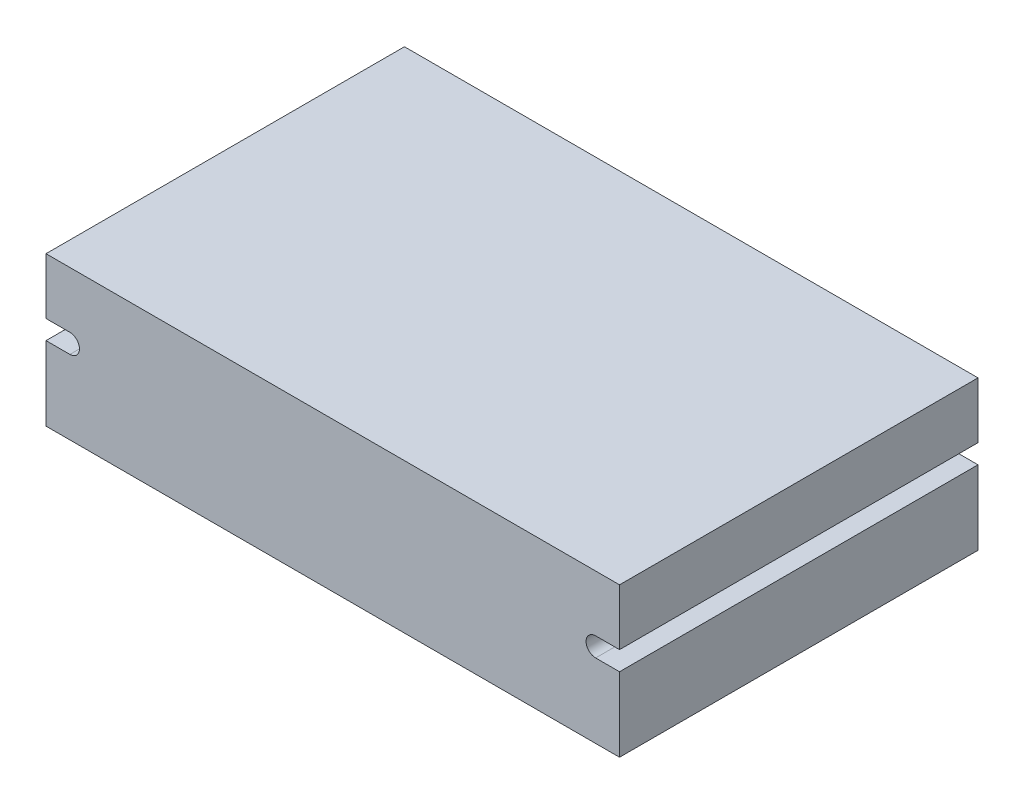
ISO-10303-21;
HEADER;
FILE_DESCRIPTION(('STEP AP214'),'2;1');
FILE_NAME('part.step','',(''),(''),'','','');
FILE_SCHEMA(('AUTOMOTIVE_DESIGN { 1 0 10303 214 1 1 1 1 }'));
ENDSEC;
DATA;
#1=APPLICATION_CONTEXT('core data for automotive mechanical design processes');
#2=APPLICATION_PROTOCOL_DEFINITION('international standard','automotive_design',2000,#1);
#3=PRODUCT_CONTEXT('',#1,'mechanical');
#4=PRODUCT('Part','Part','',(#3));
#5=PRODUCT_RELATED_PRODUCT_CATEGORY('part','',(#4));
#6=PRODUCT_DEFINITION_FORMATION('','',#4);
#7=PRODUCT_DEFINITION_CONTEXT('part definition',#1,'design');
#8=PRODUCT_DEFINITION('design','',#6,#7);
#9=PRODUCT_DEFINITION_SHAPE('','',#8);
#10=(LENGTH_UNIT() NAMED_UNIT(*) SI_UNIT(.MILLI.,.METRE.));
#11=(NAMED_UNIT(*) PLANE_ANGLE_UNIT() SI_UNIT($,.RADIAN.));
#12=(NAMED_UNIT(*) SI_UNIT($,.STERADIAN.) SOLID_ANGLE_UNIT());
#13=UNCERTAINTY_MEASURE_WITH_UNIT(LENGTH_MEASURE(1.E-05),#10,'distance_accuracy_value','');
#14=(GEOMETRIC_REPRESENTATION_CONTEXT(3) GLOBAL_UNCERTAINTY_ASSIGNED_CONTEXT((#13)) GLOBAL_UNIT_ASSIGNED_CONTEXT((#10,
#11,#12)) REPRESENTATION_CONTEXT('',''));
#15=CARTESIAN_POINT('',(0.,0.,0.));
#16=DIRECTION('',(0.,0.,1.));
#17=DIRECTION('',(1.,0.,0.));
#18=AXIS2_PLACEMENT_3D('',#15,#16,#17);
#19=CARTESIAN_POINT('',(0.,0.,60.));
#20=DIRECTION('',(1.,0.,0.));
#21=DIRECTION('',(0.,0.,-1.));
#22=AXIS2_PLACEMENT_3D('',#19,#20,#21);
#23=PLANE('',#22);
#24=DIRECTION('',(0.,-1.,0.));
#25=VECTOR('',#24,1.);
#26=CARTESIAN_POINT('',(0.,0.,0.));
#27=LINE('',#26,#25);
#28=CARTESIAN_POINT('',(0.,12.398749748951,0.));
#29=VERTEX_POINT('',#28);
#30=CARTESIAN_POINT('',(0.,0.,0.));
#31=VERTEX_POINT('',#30);
#32=EDGE_CURVE('E153',#29,#31,#27,.T.);
#33=ORIENTED_EDGE('',*,*,#32,.T.);
#34=DIRECTION('',(0.,0.,-1.));
#35=VECTOR('',#34,1.);
#36=CARTESIAN_POINT('',(0.,0.,60.));
#37=LINE('',#36,#35);
#38=CARTESIAN_POINT('',(0.,0.,60.));
#39=VERTEX_POINT('',#38);
#40=EDGE_CURVE('E11',#39,#31,#37,.T.);
#41=ORIENTED_EDGE('',*,*,#40,.F.);
#42=DIRECTION('',(0.,-1.,0.));
#43=VECTOR('',#42,1.);
#44=CARTESIAN_POINT('',(0.,0.,60.));
#45=LINE('',#44,#43);
#46=CARTESIAN_POINT('',(0.,12.398749748951,60.));
#47=VERTEX_POINT('',#46);
#48=EDGE_CURVE('E175',#47,#39,#45,.T.);
#49=ORIENTED_EDGE('',*,*,#48,.F.);
#50=DIRECTION('',(0.,0.,-1.));
#51=VECTOR('',#50,1.);
#52=CARTESIAN_POINT('',(0.,12.398749748951,60.));
#53=LINE('',#52,#51);
#54=EDGE_CURVE('E149',#47,#29,#53,.T.);
#55=ORIENTED_EDGE('',*,*,#54,.T.);
#56=EDGE_LOOP('',(#33,#41,#49,#55));
#57=FACE_BOUND('',#56,.T.);
#58=ADVANCED_FACE('F33',(#57),#23,.F.);
#59=CARTESIAN_POINT('',(0.,0.,60.));
#60=DIRECTION('',(0.,1.,0.));
#61=DIRECTION('',(0.,0.,1.));
#62=AXIS2_PLACEMENT_3D('',#59,#60,#61);
#63=PLANE('',#62);
#64=DIRECTION('',(1.,0.,0.));
#65=VECTOR('',#64,1.);
#66=CARTESIAN_POINT('',(0.,0.,0.));
#67=LINE('',#66,#65);
#68=CARTESIAN_POINT('',(96.,0.,0.));
#69=VERTEX_POINT('',#68);
#70=EDGE_CURVE('E156',#31,#69,#67,.T.);
#71=ORIENTED_EDGE('',*,*,#70,.T.);
#72=DIRECTION('',(0.,0.,-1.));
#73=VECTOR('',#72,1.);
#74=CARTESIAN_POINT('',(96.,0.,60.));
#75=LINE('',#74,#73);
#76=CARTESIAN_POINT('',(96.,0.,60.));
#77=VERTEX_POINT('',#76);
#78=EDGE_CURVE('E41',#77,#69,#75,.T.);
#79=ORIENTED_EDGE('',*,*,#78,.F.);
#80=DIRECTION('',(1.,0.,0.));
#81=VECTOR('',#80,1.);
#82=CARTESIAN_POINT('',(0.,0.,60.));
#83=LINE('',#82,#81);
#84=EDGE_CURVE('E104',#39,#77,#83,.T.);
#85=ORIENTED_EDGE('',*,*,#84,.F.);
#86=ORIENTED_EDGE('',*,*,#40,.T.);
#87=EDGE_LOOP('',(#71,#79,#85,#86));
#88=FACE_BOUND('',#87,.T.);
#89=ADVANCED_FACE('F253',(#88),#63,.F.);
#90=CARTESIAN_POINT('',(96.,0.,60.));
#91=DIRECTION('',(-1.,0.,0.));
#92=DIRECTION('',(0.,0.,1.));
#93=AXIS2_PLACEMENT_3D('',#90,#91,#92);
#94=PLANE('',#93);
#95=DIRECTION('',(0.,1.,0.));
#96=VECTOR('',#95,1.);
#97=CARTESIAN_POINT('',(96.,0.,0.));
#98=LINE('',#97,#96);
#99=CARTESIAN_POINT('',(96.,12.398749748951,0.));
#100=VERTEX_POINT('',#99);
#101=EDGE_CURVE('E158',#69,#100,#98,.T.);
#102=ORIENTED_EDGE('',*,*,#101,.T.);
#103=DIRECTION('',(0.,0.,-1.));
#104=VECTOR('',#103,1.);
#105=CARTESIAN_POINT('',(96.,12.398749748951,60.));
#106=LINE('',#105,#104);
#107=CARTESIAN_POINT('',(96.,12.398749748951,60.));
#108=VERTEX_POINT('',#107);
#109=EDGE_CURVE('E194',#108,#100,#106,.T.);
#110=ORIENTED_EDGE('',*,*,#109,.F.);
#111=DIRECTION('',(0.,1.,0.));
#112=VECTOR('',#111,1.);
#113=CARTESIAN_POINT('',(96.,0.,60.));
#114=LINE('',#113,#112);
#115=EDGE_CURVE('E202',#77,#108,#114,.T.);
#116=ORIENTED_EDGE('',*,*,#115,.F.);
#117=ORIENTED_EDGE('',*,*,#78,.T.);
#118=EDGE_LOOP('',(#102,#110,#116,#117));
#119=FACE_BOUND('',#118,.T.);
#120=ADVANCED_FACE('F200',(#119),#94,.F.);
#121=CARTESIAN_POINT('',(96.,12.398749748951,60.));
#122=DIRECTION('',(0.,-1.,0.));
#123=DIRECTION('',(0.,0.,-1.));
#124=AXIS2_PLACEMENT_3D('',#121,#122,#123);
#125=PLANE('',#124);
#126=DIRECTION('',(-1.,0.,0.));
#127=VECTOR('',#126,1.);
#128=CARTESIAN_POINT('',(96.,12.398749748951,0.));
#129=LINE('',#128,#127);
#130=CARTESIAN_POINT('',(92.,12.398749748951,0.));
#131=VERTEX_POINT('',#130);
#132=EDGE_CURVE('E160',#100,#131,#129,.T.);
#133=ORIENTED_EDGE('',*,*,#132,.T.);
#134=DIRECTION('',(0.,0.,-1.));
#135=VECTOR('',#134,1.);
#136=CARTESIAN_POINT('',(92.,12.398749748951,60.));
#137=LINE('',#136,#135);
#138=CARTESIAN_POINT('',(92.,12.398749748951,60.));
#139=VERTEX_POINT('',#138);
#140=EDGE_CURVE('E191',#139,#131,#137,.T.);
#141=ORIENTED_EDGE('',*,*,#140,.F.);
#142=DIRECTION('',(-1.,0.,0.));
#143=VECTOR('',#142,1.);
#144=CARTESIAN_POINT('',(96.,12.398749748951,60.));
#145=LINE('',#144,#143);
#146=EDGE_CURVE('E220',#108,#139,#145,.T.);
#147=ORIENTED_EDGE('',*,*,#146,.F.);
#148=ORIENTED_EDGE('',*,*,#109,.T.);
#149=EDGE_LOOP('',(#133,#141,#147,#148));
#150=FACE_BOUND('',#149,.T.);
#151=ADVANCED_FACE('F211',(#150),#125,.F.);
#152=CARTESIAN_POINT('',(92.,14.,60.));
#153=DIRECTION('',(0.,0.,-1.));
#154=DIRECTION('',(-1.,0.,0.));
#155=AXIS2_PLACEMENT_3D('',#152,#153,#154);
#156=CYLINDRICAL_SURFACE('',#155,1.60125025104899);
#157=CARTESIAN_POINT('',(92.,14.,0.));
#158=DIRECTION('',(0.,0.,-1.));
#159=DIRECTION('',(-1.,0.,0.));
#160=AXIS2_PLACEMENT_3D('',#157,#158,#159);
#161=CIRCLE('',#160,1.60125025104899);
#162=CARTESIAN_POINT('',(92.,15.601250251049,0.));
#163=VERTEX_POINT('',#162);
#164=EDGE_CURVE('E162',#131,#163,#161,.T.);
#165=ORIENTED_EDGE('',*,*,#164,.T.);
#166=DIRECTION('',(0.,0.,-1.));
#167=VECTOR('',#166,1.);
#168=CARTESIAN_POINT('',(92.,15.601250251049,60.));
#169=LINE('',#168,#167);
#170=CARTESIAN_POINT('',(92.,15.601250251049,60.));
#171=VERTEX_POINT('',#170);
#172=EDGE_CURVE('E188',#171,#163,#169,.T.);
#173=ORIENTED_EDGE('',*,*,#172,.F.);
#174=CARTESIAN_POINT('',(92.,14.,60.));
#175=DIRECTION('',(0.,0.,-1.));
#176=DIRECTION('',(-1.,0.,0.));
#177=AXIS2_PLACEMENT_3D('',#174,#175,#176);
#178=CIRCLE('',#177,1.60125025104899);
#179=EDGE_CURVE('E217',#139,#171,#178,.T.);
#180=ORIENTED_EDGE('',*,*,#179,.F.);
#181=ORIENTED_EDGE('',*,*,#140,.T.);
#182=EDGE_LOOP('',(#165,#173,#180,#181));
#183=FACE_BOUND('',#182,.T.);
#184=ADVANCED_FACE('F215',(#183),#156,.F.);
#185=CARTESIAN_POINT('',(96.,15.601250251049,60.));
#186=DIRECTION('',(0.,1.,0.));
#187=DIRECTION('',(0.,0.,1.));
#188=AXIS2_PLACEMENT_3D('',#185,#186,#187);
#189=PLANE('',#188);
#190=DIRECTION('',(1.,0.,0.));
#191=VECTOR('',#190,1.);
#192=CARTESIAN_POINT('',(96.,15.601250251049,0.));
#193=LINE('',#192,#191);
#194=CARTESIAN_POINT('',(96.,15.601250251049,0.));
#195=VERTEX_POINT('',#194);
#196=EDGE_CURVE('E164',#163,#195,#193,.T.);
#197=ORIENTED_EDGE('',*,*,#196,.T.);
#198=DIRECTION('',(0.,0.,-1.));
#199=VECTOR('',#198,1.);
#200=CARTESIAN_POINT('',(96.,15.601250251049,60.));
#201=LINE('',#200,#199);
#202=CARTESIAN_POINT('',(96.,15.601250251049,60.));
#203=VERTEX_POINT('',#202);
#204=EDGE_CURVE('E185',#203,#195,#201,.T.);
#205=ORIENTED_EDGE('',*,*,#204,.F.);
#206=DIRECTION('',(1.,0.,0.));
#207=VECTOR('',#206,1.);
#208=CARTESIAN_POINT('',(96.,15.601250251049,60.));
#209=LINE('',#208,#207);
#210=EDGE_CURVE('E219',#171,#203,#209,.T.);
#211=ORIENTED_EDGE('',*,*,#210,.F.);
#212=ORIENTED_EDGE('',*,*,#172,.T.);
#213=EDGE_LOOP('',(#197,#205,#211,#212));
#214=FACE_BOUND('',#213,.T.);
#215=ADVANCED_FACE('F266',(#214),#189,.F.);
#216=CARTESIAN_POINT('',(96.,15.601250251049,60.));
#217=DIRECTION('',(-1.,0.,0.));
#218=DIRECTION('',(0.,0.,1.));
#219=AXIS2_PLACEMENT_3D('',#216,#217,#218);
#220=PLANE('',#219);
#221=DIRECTION('',(0.,1.,0.));
#222=VECTOR('',#221,1.);
#223=CARTESIAN_POINT('',(96.,15.601250251049,0.));
#224=LINE('',#223,#222);
#225=CARTESIAN_POINT('',(96.,25.,0.));
#226=VERTEX_POINT('',#225);
#227=EDGE_CURVE('E166',#195,#226,#224,.T.);
#228=ORIENTED_EDGE('',*,*,#227,.T.);
#229=DIRECTION('',(0.,0.,-1.));
#230=VECTOR('',#229,1.);
#231=CARTESIAN_POINT('',(96.,25.,60.));
#232=LINE('',#231,#230);
#233=CARTESIAN_POINT('',(96.,25.,60.));
#234=VERTEX_POINT('',#233);
#235=EDGE_CURVE('E182',#234,#226,#232,.T.);
#236=ORIENTED_EDGE('',*,*,#235,.F.);
#237=DIRECTION('',(0.,1.,0.));
#238=VECTOR('',#237,1.);
#239=CARTESIAN_POINT('',(96.,15.601250251049,60.));
#240=LINE('',#239,#238);
#241=EDGE_CURVE('E222',#203,#234,#240,.T.);
#242=ORIENTED_EDGE('',*,*,#241,.F.);
#243=ORIENTED_EDGE('',*,*,#204,.T.);
#244=EDGE_LOOP('',(#228,#236,#242,#243));
#245=FACE_BOUND('',#244,.T.);
#246=ADVANCED_FACE('F269',(#245),#220,.F.);
#247=CARTESIAN_POINT('',(0.,25.,60.));
#248=DIRECTION('',(0.,-1.,0.));
#249=DIRECTION('',(0.,0.,-1.));
#250=AXIS2_PLACEMENT_3D('',#247,#248,#249);
#251=PLANE('',#250);
#252=DIRECTION('',(-1.,0.,0.));
#253=VECTOR('',#252,1.);
#254=CARTESIAN_POINT('',(0.,25.,0.));
#255=LINE('',#254,#253);
#256=CARTESIAN_POINT('',(0.,25.,0.));
#257=VERTEX_POINT('',#256);
#258=EDGE_CURVE('E168',#226,#257,#255,.T.);
#259=ORIENTED_EDGE('',*,*,#258,.T.);
#260=DIRECTION('',(0.,0.,-1.));
#261=VECTOR('',#260,1.);
#262=CARTESIAN_POINT('',(0.,25.,60.));
#263=LINE('',#262,#261);
#264=CARTESIAN_POINT('',(0.,25.,60.));
#265=VERTEX_POINT('',#264);
#266=EDGE_CURVE('E179',#265,#257,#263,.T.);
#267=ORIENTED_EDGE('',*,*,#266,.F.);
#268=DIRECTION('',(-1.,0.,0.));
#269=VECTOR('',#268,1.);
#270=CARTESIAN_POINT('',(0.,25.,60.));
#271=LINE('',#270,#269);
#272=EDGE_CURVE('E228',#234,#265,#271,.T.);
#273=ORIENTED_EDGE('',*,*,#272,.F.);
#274=ORIENTED_EDGE('',*,*,#235,.T.);
#275=EDGE_LOOP('',(#259,#267,#273,#274));
#276=FACE_BOUND('',#275,.T.);
#277=ADVANCED_FACE('F234',(#276),#251,.F.);
#278=CARTESIAN_POINT('',(0.,15.601250251049,60.));
#279=DIRECTION('',(1.,0.,0.));
#280=DIRECTION('',(0.,0.,-1.));
#281=AXIS2_PLACEMENT_3D('',#278,#279,#280);
#282=PLANE('',#281);
#283=DIRECTION('',(0.,-1.,0.));
#284=VECTOR('',#283,1.);
#285=CARTESIAN_POINT('',(0.,15.601250251049,0.));
#286=LINE('',#285,#284);
#287=CARTESIAN_POINT('',(0.,15.601250251049,0.));
#288=VERTEX_POINT('',#287);
#289=EDGE_CURVE('E170',#257,#288,#286,.T.);
#290=ORIENTED_EDGE('',*,*,#289,.T.);
#291=DIRECTION('',(0.,0.,-1.));
#292=VECTOR('',#291,1.);
#293=CARTESIAN_POINT('',(0.,15.601250251049,60.));
#294=LINE('',#293,#292);
#295=CARTESIAN_POINT('',(0.,15.601250251049,60.));
#296=VERTEX_POINT('',#295);
#297=EDGE_CURVE('E144',#296,#288,#294,.T.);
#298=ORIENTED_EDGE('',*,*,#297,.F.);
#299=DIRECTION('',(0.,-1.,0.));
#300=VECTOR('',#299,1.);
#301=CARTESIAN_POINT('',(0.,15.601250251049,60.));
#302=LINE('',#301,#300);
#303=EDGE_CURVE('E135',#265,#296,#302,.T.);
#304=ORIENTED_EDGE('',*,*,#303,.F.);
#305=ORIENTED_EDGE('',*,*,#266,.T.);
#306=EDGE_LOOP('',(#290,#298,#304,#305));
#307=FACE_BOUND('',#306,.T.);
#308=ADVANCED_FACE('F238',(#307),#282,.F.);
#309=CARTESIAN_POINT('',(0.,15.601250251049,60.));
#310=DIRECTION('',(0.,1.,0.));
#311=DIRECTION('',(0.,0.,1.));
#312=AXIS2_PLACEMENT_3D('',#309,#310,#311);
#313=PLANE('',#312);
#314=DIRECTION('',(1.,0.,0.));
#315=VECTOR('',#314,1.);
#316=CARTESIAN_POINT('',(0.,15.601250251049,0.));
#317=LINE('',#316,#315);
#318=CARTESIAN_POINT('',(4.,15.601250251049,0.));
#319=VERTEX_POINT('',#318);
#320=EDGE_CURVE('E143',#288,#319,#317,.T.);
#321=ORIENTED_EDGE('',*,*,#320,.T.);
#322=DIRECTION('',(0.,0.,-1.));
#323=VECTOR('',#322,1.);
#324=CARTESIAN_POINT('',(4.,15.601250251049,60.));
#325=LINE('',#324,#323);
#326=CARTESIAN_POINT('',(4.,15.601250251049,60.));
#327=VERTEX_POINT('',#326);
#328=EDGE_CURVE('E140',#327,#319,#325,.T.);
#329=ORIENTED_EDGE('',*,*,#328,.F.);
#330=DIRECTION('',(1.,0.,0.));
#331=VECTOR('',#330,1.);
#332=CARTESIAN_POINT('',(0.,15.601250251049,60.));
#333=LINE('',#332,#331);
#334=EDGE_CURVE('E129',#296,#327,#333,.T.);
#335=ORIENTED_EDGE('',*,*,#334,.F.);
#336=ORIENTED_EDGE('',*,*,#297,.T.);
#337=EDGE_LOOP('',(#321,#329,#335,#336));
#338=FACE_BOUND('',#337,.T.);
#339=ADVANCED_FACE('F141',(#338),#313,.F.);
#340=CARTESIAN_POINT('',(4.,14.,60.));
#341=DIRECTION('',(0.,0.,-1.));
#342=DIRECTION('',(-1.,0.,0.));
#343=AXIS2_PLACEMENT_3D('',#340,#341,#342);
#344=CYLINDRICAL_SURFACE('',#343,1.60125025104899);
#345=CARTESIAN_POINT('',(4.,14.,0.));
#346=DIRECTION('',(0.,0.,-1.));
#347=DIRECTION('',(1.,0.,0.));
#348=AXIS2_PLACEMENT_3D('',#345,#346,#347);
#349=CIRCLE('',#348,1.60125025104899);
#350=CARTESIAN_POINT('',(4.,12.398749748951,0.));
#351=VERTEX_POINT('',#350);
#352=EDGE_CURVE('E90',#319,#351,#349,.T.);
#353=ORIENTED_EDGE('',*,*,#352,.T.);
#354=DIRECTION('',(0.,0.,-1.));
#355=VECTOR('',#354,1.);
#356=CARTESIAN_POINT('',(4.,12.398749748951,60.));
#357=LINE('',#356,#355);
#358=CARTESIAN_POINT('',(4.,12.398749748951,60.));
#359=VERTEX_POINT('',#358);
#360=EDGE_CURVE('E145',#359,#351,#357,.T.);
#361=ORIENTED_EDGE('',*,*,#360,.F.);
#362=CARTESIAN_POINT('',(4.,14.,60.));
#363=DIRECTION('',(0.,0.,-1.));
#364=DIRECTION('',(1.,0.,0.));
#365=AXIS2_PLACEMENT_3D('',#362,#363,#364);
#366=CIRCLE('',#365,1.60125025104899);
#367=EDGE_CURVE('E133',#327,#359,#366,.T.);
#368=ORIENTED_EDGE('',*,*,#367,.F.);
#369=ORIENTED_EDGE('',*,*,#328,.T.);
#370=EDGE_LOOP('',(#353,#361,#368,#369));
#371=FACE_BOUND('',#370,.T.);
#372=ADVANCED_FACE('F147',(#371),#344,.F.);
#373=CARTESIAN_POINT('',(0.,12.398749748951,60.));
#374=DIRECTION('',(0.,-1.,0.));
#375=DIRECTION('',(0.,0.,-1.));
#376=AXIS2_PLACEMENT_3D('',#373,#374,#375);
#377=PLANE('',#376);
#378=DIRECTION('',(-1.,0.,0.));
#379=VECTOR('',#378,1.);
#380=CARTESIAN_POINT('',(0.,12.398749748951,0.));
#381=LINE('',#380,#379);
#382=EDGE_CURVE('E96',#351,#29,#381,.T.);
#383=ORIENTED_EDGE('',*,*,#382,.T.);
#384=ORIENTED_EDGE('',*,*,#54,.F.);
#385=DIRECTION('',(-1.,0.,0.));
#386=VECTOR('',#385,1.);
#387=CARTESIAN_POINT('',(0.,12.398749748951,60.));
#388=LINE('',#387,#386);
#389=EDGE_CURVE('E49',#359,#47,#388,.T.);
#390=ORIENTED_EDGE('',*,*,#389,.F.);
#391=ORIENTED_EDGE('',*,*,#360,.T.);
#392=EDGE_LOOP('',(#383,#384,#390,#391));
#393=FACE_BOUND('',#392,.T.);
#394=ADVANCED_FACE('F242',(#393),#377,.F.);
#395=CARTESIAN_POINT('',(4.,14.,60.));
#396=DIRECTION('',(0.,0.,1.));
#397=DIRECTION('',(1.,0.,0.));
#398=AXIS2_PLACEMENT_3D('',#395,#396,#397);
#399=PLANE('',#398);
#400=ORIENTED_EDGE('',*,*,#48,.T.);
#401=ORIENTED_EDGE('',*,*,#84,.T.);
#402=ORIENTED_EDGE('',*,*,#115,.T.);
#403=ORIENTED_EDGE('',*,*,#146,.T.);
#404=ORIENTED_EDGE('',*,*,#179,.T.);
#405=ORIENTED_EDGE('',*,*,#210,.T.);
#406=ORIENTED_EDGE('',*,*,#241,.T.);
#407=ORIENTED_EDGE('',*,*,#272,.T.);
#408=ORIENTED_EDGE('',*,*,#303,.T.);
#409=ORIENTED_EDGE('',*,*,#334,.T.);
#410=ORIENTED_EDGE('',*,*,#367,.T.);
#411=ORIENTED_EDGE('',*,*,#389,.T.);
#412=EDGE_LOOP('',(#400,#401,#402,#403,#404,#405,#406,#407,#408,#409,#410,#411));
#413=FACE_BOUND('',#412,.T.);
#414=ADVANCED_FACE('F131',(#413),#399,.T.);
#415=CARTESIAN_POINT('',(4.,14.,0.));
#416=DIRECTION('',(0.,0.,1.));
#417=DIRECTION('',(1.,0.,0.));
#418=AXIS2_PLACEMENT_3D('',#415,#416,#417);
#419=PLANE('',#418);
#420=ORIENTED_EDGE('',*,*,#32,.F.);
#421=ORIENTED_EDGE('',*,*,#382,.F.);
#422=ORIENTED_EDGE('',*,*,#352,.F.);
#423=ORIENTED_EDGE('',*,*,#320,.F.);
#424=ORIENTED_EDGE('',*,*,#289,.F.);
#425=ORIENTED_EDGE('',*,*,#258,.F.);
#426=ORIENTED_EDGE('',*,*,#227,.F.);
#427=ORIENTED_EDGE('',*,*,#196,.F.);
#428=ORIENTED_EDGE('',*,*,#164,.F.);
#429=ORIENTED_EDGE('',*,*,#132,.F.);
#430=ORIENTED_EDGE('',*,*,#101,.F.);
#431=ORIENTED_EDGE('',*,*,#70,.F.);
#432=EDGE_LOOP('',(#420,#421,#422,#423,#424,#425,#426,#427,#428,#429,#430,#431));
#433=FACE_BOUND('',#432,.T.);
#434=ADVANCED_FACE('F206',(#433),#419,.F.);
#435=CLOSED_SHELL('',(#58,#89,#120,#151,#184,#215,#246,#277,#308,#339,#372,#394,#414,#434));
#436=MANIFOLD_SOLID_BREP('B2',#435);
#437=ADVANCED_BREP_SHAPE_REPRESENTATION('',(#18,#436),#14);
#438=SHAPE_DEFINITION_REPRESENTATION(#9,#437);
ENDSEC;
END-ISO-10303-21;
